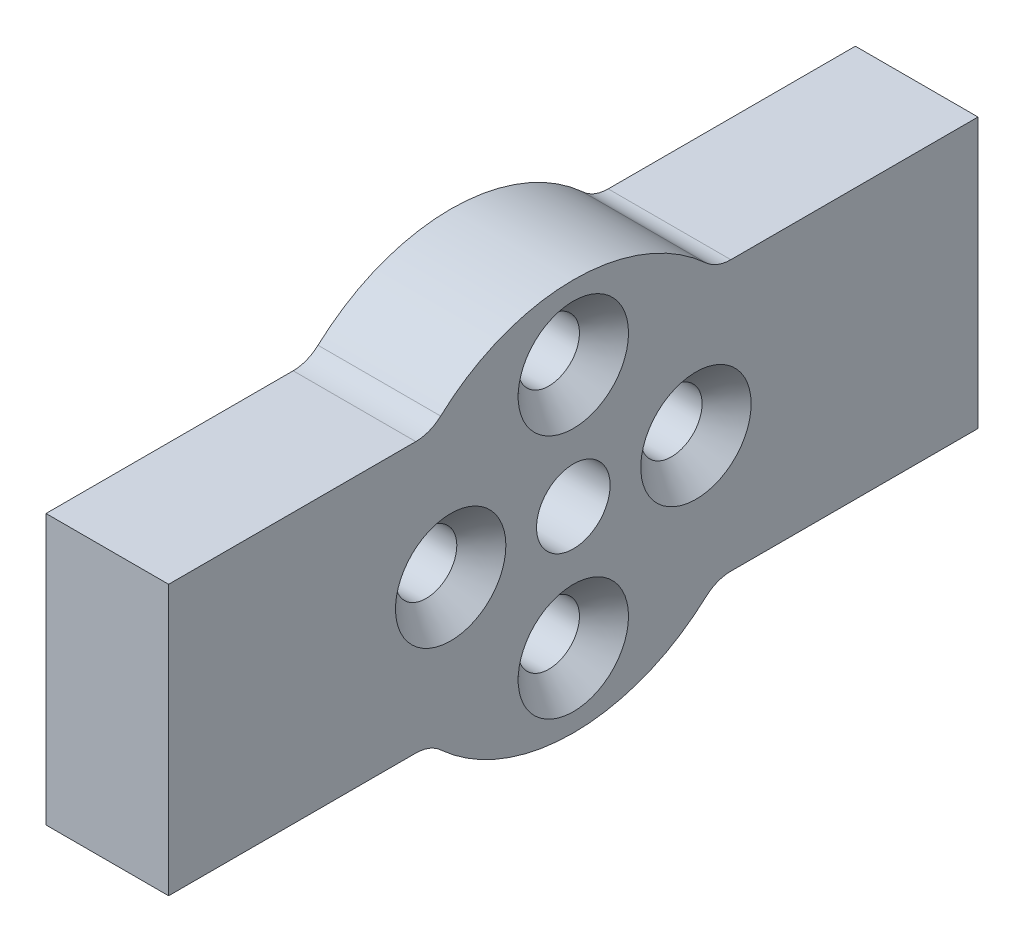
ISO-10303-21;
HEADER;
FILE_DESCRIPTION(('STEP AP214'),'2;1');
FILE_NAME('part.step','',(''),(''),'','','');
FILE_SCHEMA(('AUTOMOTIVE_DESIGN { 1 0 10303 214 1 1 1 1 }'));
ENDSEC;
DATA;
#1=APPLICATION_CONTEXT('core data for automotive mechanical design processes');
#2=APPLICATION_PROTOCOL_DEFINITION('international standard','automotive_design',2000,#1);
#3=PRODUCT_CONTEXT('',#1,'mechanical');
#4=PRODUCT('Part','Part','',(#3));
#5=PRODUCT_RELATED_PRODUCT_CATEGORY('part','',(#4));
#6=PRODUCT_DEFINITION_FORMATION('','',#4);
#7=PRODUCT_DEFINITION_CONTEXT('part definition',#1,'design');
#8=PRODUCT_DEFINITION('design','',#6,#7);
#9=PRODUCT_DEFINITION_SHAPE('','',#8);
#10=(LENGTH_UNIT() NAMED_UNIT(*) SI_UNIT(.MILLI.,.METRE.));
#11=(NAMED_UNIT(*) PLANE_ANGLE_UNIT() SI_UNIT($,.RADIAN.));
#12=(NAMED_UNIT(*) SI_UNIT($,.STERADIAN.) SOLID_ANGLE_UNIT());
#13=UNCERTAINTY_MEASURE_WITH_UNIT(LENGTH_MEASURE(1.E-05),#10,'distance_accuracy_value','');
#14=(GEOMETRIC_REPRESENTATION_CONTEXT(3) GLOBAL_UNCERTAINTY_ASSIGNED_CONTEXT((#13)) GLOBAL_UNIT_ASSIGNED_CONTEXT((#10,
#11,#12)) REPRESENTATION_CONTEXT('',''));
#15=CARTESIAN_POINT('',(0.,0.,0.));
#16=DIRECTION('',(0.,0.,1.));
#17=DIRECTION('',(1.,0.,0.));
#18=AXIS2_PLACEMENT_3D('',#15,#16,#17);
#19=CARTESIAN_POINT('',(0.,-1.39659314221713E-13,9.99999999999986));
#20=DIRECTION('',(1.,0.,0.));
#21=DIRECTION('',(0.,0.,-1.));
#22=AXIS2_PLACEMENT_3D('',#19,#20,#21);
#23=CYLINDRICAL_SURFACE('',#22,2.50000000000027);
#24=CARTESIAN_POINT('',(0.,-1.39659314221713E-13,9.99999999999986));
#25=DIRECTION('',(1.,0.,0.));
#26=DIRECTION('',(0.,0.,-1.));
#27=AXIS2_PLACEMENT_3D('',#24,#25,#26);
#28=CIRCLE('',#27,2.50000000000027);
#29=CARTESIAN_POINT('',(0.,-1.39659314221713E-13,7.49999999999959));
#30=VERTEX_POINT('',#29);
#31=EDGE_CURVE('E288',#30,#30,#28,.T.);
#32=ORIENTED_EDGE('',*,*,#31,.F.);
#33=EDGE_LOOP('',(#32));
#34=FACE_BOUND('',#33,.T.);
#35=CARTESIAN_POINT('',(8.,1.04744500833281E-13,10.));
#36=DIRECTION('',(1.,0.,0.));
#37=DIRECTION('',(0.,0.,-1.));
#38=AXIS2_PLACEMENT_3D('',#35,#36,#37);
#39=CIRCLE('',#38,2.5);
#40=CARTESIAN_POINT('',(8.,1.04744500833281E-13,7.5));
#41=VERTEX_POINT('',#40);
#42=EDGE_CURVE('E324',#41,#41,#39,.T.);
#43=ORIENTED_EDGE('',*,*,#42,.T.);
#44=EDGE_LOOP('',(#43));
#45=FACE_BOUND('',#44,.T.);
#46=ADVANCED_FACE('F31',(#34,#45),#23,.F.);
#47=CARTESIAN_POINT('',(0.,-10.,-2.8176792204172E-13));
#48=DIRECTION('',(1.,0.,0.));
#49=DIRECTION('',(0.,0.,-1.));
#50=AXIS2_PLACEMENT_3D('',#47,#48,#49);
#51=CYLINDRICAL_SURFACE('',#50,2.50000000000034);
#52=CARTESIAN_POINT('',(0.,-10.,-2.8176792204172E-13));
#53=DIRECTION('',(1.,0.,0.));
#54=DIRECTION('',(0.,0.,-1.));
#55=AXIS2_PLACEMENT_3D('',#52,#53,#54);
#56=CIRCLE('',#55,2.50000000000034);
#57=CARTESIAN_POINT('',(0.,-10.,-2.50000000000062));
#58=VERTEX_POINT('',#57);
#59=EDGE_CURVE('E292',#58,#58,#56,.T.);
#60=ORIENTED_EDGE('',*,*,#59,.F.);
#61=EDGE_LOOP('',(#60));
#62=FACE_BOUND('',#61,.T.);
#63=CARTESIAN_POINT('',(8.,-10.,-2.8176792204172E-13));
#64=DIRECTION('',(1.,0.,0.));
#65=DIRECTION('',(0.,0.,-1.));
#66=AXIS2_PLACEMENT_3D('',#63,#64,#65);
#67=CIRCLE('',#66,2.50000000000033);
#68=CARTESIAN_POINT('',(8.,-10.,-2.50000000000062));
#69=VERTEX_POINT('',#68);
#70=EDGE_CURVE('E318',#69,#69,#67,.T.);
#71=ORIENTED_EDGE('',*,*,#70,.T.);
#72=EDGE_LOOP('',(#71));
#73=FACE_BOUND('',#72,.T.);
#74=ADVANCED_FACE('F254',(#62,#73),#51,.F.);
#75=CARTESIAN_POINT('',(0.,0.,-10.));
#76=DIRECTION('',(1.,0.,0.));
#77=DIRECTION('',(0.,0.,-1.));
#78=AXIS2_PLACEMENT_3D('',#75,#76,#77);
#79=CYLINDRICAL_SURFACE('',#78,2.5);
#80=CARTESIAN_POINT('',(0.,0.,-10.));
#81=DIRECTION('',(1.,0.,0.));
#82=DIRECTION('',(0.,0.,-1.));
#83=AXIS2_PLACEMENT_3D('',#80,#81,#82);
#84=CIRCLE('',#83,2.5);
#85=CARTESIAN_POINT('',(0.,0.,-12.5));
#86=VERTEX_POINT('',#85);
#87=EDGE_CURVE('E296',#86,#86,#84,.T.);
#88=ORIENTED_EDGE('',*,*,#87,.F.);
#89=EDGE_LOOP('',(#88));
#90=FACE_BOUND('',#89,.T.);
#91=CARTESIAN_POINT('',(8.,0.,-10.));
#92=DIRECTION('',(1.,0.,0.));
#93=DIRECTION('',(0.,0.,-1.));
#94=AXIS2_PLACEMENT_3D('',#91,#92,#93);
#95=CIRCLE('',#94,2.5);
#96=CARTESIAN_POINT('',(8.,0.,-12.5));
#97=VERTEX_POINT('',#96);
#98=EDGE_CURVE('E312',#97,#97,#95,.T.);
#99=ORIENTED_EDGE('',*,*,#98,.T.);
#100=EDGE_LOOP('',(#99));
#101=FACE_BOUND('',#100,.T.);
#102=ADVANCED_FACE('F260',(#90,#101),#79,.F.);
#103=CARTESIAN_POINT('',(0.,10.,0.));
#104=DIRECTION('',(1.,0.,0.));
#105=DIRECTION('',(0.,0.,-1.));
#106=AXIS2_PLACEMENT_3D('',#103,#104,#105);
#107=CYLINDRICAL_SURFACE('',#106,2.5);
#108=CARTESIAN_POINT('',(0.,10.,0.));
#109=DIRECTION('',(1.,0.,0.));
#110=DIRECTION('',(0.,0.,-1.));
#111=AXIS2_PLACEMENT_3D('',#108,#109,#110);
#112=CIRCLE('',#111,2.5);
#113=CARTESIAN_POINT('',(0.,10.,-2.5));
#114=VERTEX_POINT('',#113);
#115=EDGE_CURVE('E156',#114,#114,#112,.T.);
#116=ORIENTED_EDGE('',*,*,#115,.F.);
#117=EDGE_LOOP('',(#116));
#118=FACE_BOUND('',#117,.T.);
#119=CARTESIAN_POINT('',(8.,10.,0.));
#120=DIRECTION('',(1.,0.,0.));
#121=DIRECTION('',(0.,0.,-1.));
#122=AXIS2_PLACEMENT_3D('',#119,#120,#121);
#123=CIRCLE('',#122,2.5);
#124=CARTESIAN_POINT('',(8.,10.,-2.5));
#125=VERTEX_POINT('',#124);
#126=EDGE_CURVE('E306',#125,#125,#123,.T.);
#127=ORIENTED_EDGE('',*,*,#126,.T.);
#128=EDGE_LOOP('',(#127));
#129=FACE_BOUND('',#128,.T.);
#130=ADVANCED_FACE('F271',(#118,#129),#107,.F.);
#131=CARTESIAN_POINT('',(10.,-11.,-12.8452325786651));
#132=DIRECTION('',(0.,1.,0.));
#133=DIRECTION('',(0.,0.,1.));
#134=AXIS2_PLACEMENT_3D('',#131,#132,#133);
#135=PLANE('',#134);
#136=DIRECTION('',(0.,0.,-1.));
#137=VECTOR('',#136,1.);
#138=CARTESIAN_POINT('',(0.,-11.,-12.8452325786651));
#139=LINE('',#138,#137);
#140=CARTESIAN_POINT('',(0.,-11.,-12.8452325786651));
#141=VERTEX_POINT('',#140);
#142=CARTESIAN_POINT('',(0.,-11.,-33.));
#143=VERTEX_POINT('',#142);
#144=EDGE_CURVE('E152',#141,#143,#139,.T.);
#145=ORIENTED_EDGE('',*,*,#144,.T.);
#146=DIRECTION('',(-1.,0.,0.));
#147=VECTOR('',#146,1.);
#148=CARTESIAN_POINT('',(10.,-11.,-33.));
#149=LINE('',#148,#147);
#150=CARTESIAN_POINT('',(10.,-11.,-33.));
#151=VERTEX_POINT('',#150);
#152=EDGE_CURVE('E11',#151,#143,#149,.T.);
#153=ORIENTED_EDGE('',*,*,#152,.F.);
#154=DIRECTION('',(0.,0.,-1.));
#155=VECTOR('',#154,1.);
#156=CARTESIAN_POINT('',(10.,-11.,-12.8452325786651));
#157=LINE('',#156,#155);
#158=CARTESIAN_POINT('',(10.,-11.,-12.8452325786651));
#159=VERTEX_POINT('',#158);
#160=EDGE_CURVE('E175',#159,#151,#157,.T.);
#161=ORIENTED_EDGE('',*,*,#160,.F.);
#162=DIRECTION('',(-1.,0.,0.));
#163=VECTOR('',#162,1.);
#164=CARTESIAN_POINT('',(10.,-11.,-12.8452325786651));
#165=LINE('',#164,#163);
#166=EDGE_CURVE('E148',#159,#141,#165,.T.);
#167=ORIENTED_EDGE('',*,*,#166,.T.);
#168=EDGE_LOOP('',(#145,#153,#161,#167));
#169=FACE_BOUND('',#168,.T.);
#170=ADVANCED_FACE('F33',(#169),#135,.F.);
#171=CARTESIAN_POINT('',(10.,11.,-33.));
#172=DIRECTION('',(0.,0.,1.));
#173=DIRECTION('',(1.,0.,0.));
#174=AXIS2_PLACEMENT_3D('',#171,#172,#173);
#175=PLANE('',#174);
#176=DIRECTION('',(0.,1.,0.));
#177=VECTOR('',#176,1.);
#178=CARTESIAN_POINT('',(0.,11.,-33.));
#179=LINE('',#178,#177);
#180=CARTESIAN_POINT('',(0.,11.,-33.));
#181=VERTEX_POINT('',#180);
#182=EDGE_CURVE('E155',#143,#181,#179,.T.);
#183=ORIENTED_EDGE('',*,*,#182,.T.);
#184=DIRECTION('',(-1.,0.,0.));
#185=VECTOR('',#184,1.);
#186=CARTESIAN_POINT('',(10.,11.,-33.));
#187=LINE('',#186,#185);
#188=CARTESIAN_POINT('',(10.,11.,-33.));
#189=VERTEX_POINT('',#188);
#190=EDGE_CURVE('E40',#189,#181,#187,.T.);
#191=ORIENTED_EDGE('',*,*,#190,.F.);
#192=DIRECTION('',(0.,1.,0.));
#193=VECTOR('',#192,1.);
#194=CARTESIAN_POINT('',(10.,11.,-33.));
#195=LINE('',#194,#193);
#196=EDGE_CURVE('E103',#151,#189,#195,.T.);
#197=ORIENTED_EDGE('',*,*,#196,.F.);
#198=ORIENTED_EDGE('',*,*,#152,.T.);
#199=EDGE_LOOP('',(#183,#191,#197,#198));
#200=FACE_BOUND('',#199,.T.);
#201=ADVANCED_FACE('F487',(#200),#175,.F.);
#202=CARTESIAN_POINT('',(10.,11.,-12.8452325786651));
#203=DIRECTION('',(0.,-1.,0.));
#204=DIRECTION('',(0.,0.,-1.));
#205=AXIS2_PLACEMENT_3D('',#202,#203,#204);
#206=PLANE('',#205);
#207=DIRECTION('',(0.,0.,1.));
#208=VECTOR('',#207,1.);
#209=CARTESIAN_POINT('',(0.,11.,-12.8452325786651));
#210=LINE('',#209,#208);
#211=CARTESIAN_POINT('',(0.,11.,-12.8452325786651));
#212=VERTEX_POINT('',#211);
#213=EDGE_CURVE('E158',#181,#212,#210,.T.);
#214=ORIENTED_EDGE('',*,*,#213,.T.);
#215=DIRECTION('',(-1.,0.,0.));
#216=VECTOR('',#215,1.);
#217=CARTESIAN_POINT('',(10.,11.,-12.8452325786651));
#218=LINE('',#217,#216);
#219=CARTESIAN_POINT('',(10.,11.,-12.8452325786651));
#220=VERTEX_POINT('',#219);
#221=EDGE_CURVE('E194',#220,#212,#218,.T.);
#222=ORIENTED_EDGE('',*,*,#221,.F.);
#223=DIRECTION('',(0.,0.,1.));
#224=VECTOR('',#223,1.);
#225=CARTESIAN_POINT('',(10.,11.,-12.8452325786651));
#226=LINE('',#225,#224);
#227=EDGE_CURVE('E202',#189,#220,#226,.T.);
#228=ORIENTED_EDGE('',*,*,#227,.F.);
#229=ORIENTED_EDGE('',*,*,#190,.T.);
#230=EDGE_LOOP('',(#214,#222,#228,#229));
#231=FACE_BOUND('',#230,.T.);
#232=ADVANCED_FACE('F200',(#231),#206,.F.);
#233=CARTESIAN_POINT('',(10.,14.,-12.8452325786651));
#234=DIRECTION('',(-1.,0.,0.));
#235=DIRECTION('',(0.,0.,1.));
#236=AXIS2_PLACEMENT_3D('',#233,#234,#235);
#237=CYLINDRICAL_SURFACE('',#236,3.);
#238=CARTESIAN_POINT('',(0.,14.,-12.8452325786651));
#239=DIRECTION('',(-1.,0.,0.));
#240=DIRECTION('',(0.,0.,1.));
#241=AXIS2_PLACEMENT_3D('',#238,#239,#240);
#242=CIRCLE('',#241,3.);
#243=CARTESIAN_POINT('',(0.,11.7894736842105,-10.8170379609812));
#244=VERTEX_POINT('',#243);
#245=EDGE_CURVE('E160',#212,#244,#242,.T.);
#246=ORIENTED_EDGE('',*,*,#245,.T.);
#247=DIRECTION('',(-1.,0.,0.));
#248=VECTOR('',#247,1.);
#249=CARTESIAN_POINT('',(10.,11.7894736842105,-10.8170379609812));
#250=LINE('',#249,#248);
#251=CARTESIAN_POINT('',(10.,11.7894736842105,-10.8170379609812));
#252=VERTEX_POINT('',#251);
#253=EDGE_CURVE('E191',#252,#244,#250,.T.);
#254=ORIENTED_EDGE('',*,*,#253,.F.);
#255=CARTESIAN_POINT('',(10.,14.,-12.8452325786651));
#256=DIRECTION('',(-1.,0.,0.));
#257=DIRECTION('',(0.,0.,1.));
#258=AXIS2_PLACEMENT_3D('',#255,#256,#257);
#259=CIRCLE('',#258,3.);
#260=EDGE_CURVE('E220',#220,#252,#259,.T.);
#261=ORIENTED_EDGE('',*,*,#260,.F.);
#262=ORIENTED_EDGE('',*,*,#221,.T.);
#263=EDGE_LOOP('',(#246,#254,#261,#262));
#264=FACE_BOUND('',#263,.T.);
#265=ADVANCED_FACE('F211',(#264),#237,.F.);
#266=CARTESIAN_POINT('',(10.,0.,0.));
#267=DIRECTION('',(-1.,0.,0.));
#268=DIRECTION('',(0.,0.,1.));
#269=AXIS2_PLACEMENT_3D('',#266,#267,#268);
#270=CYLINDRICAL_SURFACE('',#269,16.);
#271=CARTESIAN_POINT('',(0.,0.,0.));
#272=DIRECTION('',(1.,0.,0.));
#273=DIRECTION('',(0.,0.,-1.));
#274=AXIS2_PLACEMENT_3D('',#271,#272,#273);
#275=CIRCLE('',#274,16.);
#276=CARTESIAN_POINT('',(0.,11.7894736842105,10.8170379609812));
#277=VERTEX_POINT('',#276);
#278=EDGE_CURVE('E162',#244,#277,#275,.T.);
#279=ORIENTED_EDGE('',*,*,#278,.T.);
#280=DIRECTION('',(-1.,0.,0.));
#281=VECTOR('',#280,1.);
#282=CARTESIAN_POINT('',(10.,11.7894736842105,10.8170379609812));
#283=LINE('',#282,#281);
#284=CARTESIAN_POINT('',(10.,11.7894736842105,10.8170379609812));
#285=VERTEX_POINT('',#284);
#286=EDGE_CURVE('E188',#285,#277,#283,.T.);
#287=ORIENTED_EDGE('',*,*,#286,.F.);
#288=CARTESIAN_POINT('',(10.,0.,0.));
#289=DIRECTION('',(1.,0.,0.));
#290=DIRECTION('',(0.,0.,-1.));
#291=AXIS2_PLACEMENT_3D('',#288,#289,#290);
#292=CIRCLE('',#291,16.);
#293=EDGE_CURVE('E217',#252,#285,#292,.T.);
#294=ORIENTED_EDGE('',*,*,#293,.F.);
#295=ORIENTED_EDGE('',*,*,#253,.T.);
#296=EDGE_LOOP('',(#279,#287,#294,#295));
#297=FACE_BOUND('',#296,.T.);
#298=ADVANCED_FACE('F215',(#297),#270,.T.);
#299=CARTESIAN_POINT('',(10.,14.,12.8452325786651));
#300=DIRECTION('',(-1.,0.,0.));
#301=DIRECTION('',(0.,0.,1.));
#302=AXIS2_PLACEMENT_3D('',#299,#300,#301);
#303=CYLINDRICAL_SURFACE('',#302,3.);
#304=CARTESIAN_POINT('',(0.,14.,12.8452325786651));
#305=DIRECTION('',(-1.,0.,0.));
#306=DIRECTION('',(0.,0.,1.));
#307=AXIS2_PLACEMENT_3D('',#304,#305,#306);
#308=CIRCLE('',#307,3.);
#309=CARTESIAN_POINT('',(0.,11.,12.8452325786651));
#310=VERTEX_POINT('',#309);
#311=EDGE_CURVE('E164',#277,#310,#308,.T.);
#312=ORIENTED_EDGE('',*,*,#311,.T.);
#313=DIRECTION('',(-1.,0.,0.));
#314=VECTOR('',#313,1.);
#315=CARTESIAN_POINT('',(10.,11.,12.8452325786651));
#316=LINE('',#315,#314);
#317=CARTESIAN_POINT('',(10.,11.,12.8452325786651));
#318=VERTEX_POINT('',#317);
#319=EDGE_CURVE('E185',#318,#310,#316,.T.);
#320=ORIENTED_EDGE('',*,*,#319,.F.);
#321=CARTESIAN_POINT('',(10.,14.,12.8452325786651));
#322=DIRECTION('',(-1.,0.,0.));
#323=DIRECTION('',(0.,0.,1.));
#324=AXIS2_PLACEMENT_3D('',#321,#322,#323);
#325=CIRCLE('',#324,3.);
#326=EDGE_CURVE('E219',#285,#318,#325,.T.);
#327=ORIENTED_EDGE('',*,*,#326,.F.);
#328=ORIENTED_EDGE('',*,*,#286,.T.);
#329=EDGE_LOOP('',(#312,#320,#327,#328));
#330=FACE_BOUND('',#329,.T.);
#331=ADVANCED_FACE('F452',(#330),#303,.F.);
#332=CARTESIAN_POINT('',(10.,11.,33.));
#333=DIRECTION('',(0.,-1.,0.));
#334=DIRECTION('',(0.,0.,-1.));
#335=AXIS2_PLACEMENT_3D('',#332,#333,#334);
#336=PLANE('',#335);
#337=DIRECTION('',(0.,0.,1.));
#338=VECTOR('',#337,1.);
#339=CARTESIAN_POINT('',(0.,11.,33.));
#340=LINE('',#339,#338);
#341=CARTESIAN_POINT('',(0.,11.,33.));
#342=VERTEX_POINT('',#341);
#343=EDGE_CURVE('E166',#310,#342,#340,.T.);
#344=ORIENTED_EDGE('',*,*,#343,.T.);
#345=DIRECTION('',(-1.,0.,0.));
#346=VECTOR('',#345,1.);
#347=CARTESIAN_POINT('',(10.,11.,33.));
#348=LINE('',#347,#346);
#349=CARTESIAN_POINT('',(10.,11.,33.));
#350=VERTEX_POINT('',#349);
#351=EDGE_CURVE('E182',#350,#342,#348,.T.);
#352=ORIENTED_EDGE('',*,*,#351,.F.);
#353=DIRECTION('',(0.,0.,1.));
#354=VECTOR('',#353,1.);
#355=CARTESIAN_POINT('',(10.,11.,33.));
#356=LINE('',#355,#354);
#357=EDGE_CURVE('E222',#318,#350,#356,.T.);
#358=ORIENTED_EDGE('',*,*,#357,.F.);
#359=ORIENTED_EDGE('',*,*,#319,.T.);
#360=EDGE_LOOP('',(#344,#352,#358,#359));
#361=FACE_BOUND('',#360,.T.);
#362=ADVANCED_FACE('F443',(#361),#336,.F.);
#363=CARTESIAN_POINT('',(10.,11.,33.));
#364=DIRECTION('',(0.,0.,-1.));
#365=DIRECTION('',(-1.,0.,0.));
#366=AXIS2_PLACEMENT_3D('',#363,#364,#365);
#367=PLANE('',#366);
#368=DIRECTION('',(0.,-1.,0.));
#369=VECTOR('',#368,1.);
#370=CARTESIAN_POINT('',(0.,11.,33.));
#371=LINE('',#370,#369);
#372=CARTESIAN_POINT('',(0.,-11.,33.));
#373=VERTEX_POINT('',#372);
#374=EDGE_CURVE('E168',#342,#373,#371,.T.);
#375=ORIENTED_EDGE('',*,*,#374,.T.);
#376=DIRECTION('',(-1.,0.,0.));
#377=VECTOR('',#376,1.);
#378=CARTESIAN_POINT('',(10.,-11.,33.));
#379=LINE('',#378,#377);
#380=CARTESIAN_POINT('',(10.,-11.,33.));
#381=VERTEX_POINT('',#380);
#382=EDGE_CURVE('E179',#381,#373,#379,.T.);
#383=ORIENTED_EDGE('',*,*,#382,.F.);
#384=DIRECTION('',(0.,-1.,0.));
#385=VECTOR('',#384,1.);
#386=CARTESIAN_POINT('',(10.,11.,33.));
#387=LINE('',#386,#385);
#388=EDGE_CURVE('E228',#350,#381,#387,.T.);
#389=ORIENTED_EDGE('',*,*,#388,.F.);
#390=ORIENTED_EDGE('',*,*,#351,.T.);
#391=EDGE_LOOP('',(#375,#383,#389,#390));
#392=FACE_BOUND('',#391,.T.);
#393=ADVANCED_FACE('F234',(#392),#367,.F.);
#394=CARTESIAN_POINT('',(10.,-11.,33.));
#395=DIRECTION('',(0.,1.,0.));
#396=DIRECTION('',(0.,0.,1.));
#397=AXIS2_PLACEMENT_3D('',#394,#395,#396);
#398=PLANE('',#397);
#399=DIRECTION('',(0.,0.,-1.));
#400=VECTOR('',#399,1.);
#401=CARTESIAN_POINT('',(0.,-11.,33.));
#402=LINE('',#401,#400);
#403=CARTESIAN_POINT('',(0.,-11.,12.8452325786651));
#404=VERTEX_POINT('',#403);
#405=EDGE_CURVE('E170',#373,#404,#402,.T.);
#406=ORIENTED_EDGE('',*,*,#405,.T.);
#407=DIRECTION('',(-1.,0.,0.));
#408=VECTOR('',#407,1.);
#409=CARTESIAN_POINT('',(10.,-11.,12.8452325786651));
#410=LINE('',#409,#408);
#411=CARTESIAN_POINT('',(10.,-11.,12.8452325786651));
#412=VERTEX_POINT('',#411);
#413=EDGE_CURVE('E143',#412,#404,#410,.T.);
#414=ORIENTED_EDGE('',*,*,#413,.F.);
#415=DIRECTION('',(0.,0.,-1.));
#416=VECTOR('',#415,1.);
#417=CARTESIAN_POINT('',(10.,-11.,33.));
#418=LINE('',#417,#416);
#419=EDGE_CURVE('E134',#381,#412,#418,.T.);
#420=ORIENTED_EDGE('',*,*,#419,.F.);
#421=ORIENTED_EDGE('',*,*,#382,.T.);
#422=EDGE_LOOP('',(#406,#414,#420,#421));
#423=FACE_BOUND('',#422,.T.);
#424=ADVANCED_FACE('F238',(#423),#398,.F.);
#425=CARTESIAN_POINT('',(10.,-14.,12.8452325786651));
#426=DIRECTION('',(-1.,0.,0.));
#427=DIRECTION('',(0.,0.,1.));
#428=AXIS2_PLACEMENT_3D('',#425,#426,#427);
#429=CYLINDRICAL_SURFACE('',#428,3.);
#430=CARTESIAN_POINT('',(0.,-14.,12.8452325786651));
#431=DIRECTION('',(-1.,0.,0.));
#432=DIRECTION('',(0.,0.,1.));
#433=AXIS2_PLACEMENT_3D('',#430,#431,#432);
#434=CIRCLE('',#433,3.);
#435=CARTESIAN_POINT('',(0.,-11.7894736842105,10.8170379609812));
#436=VERTEX_POINT('',#435);
#437=EDGE_CURVE('E142',#404,#436,#434,.T.);
#438=ORIENTED_EDGE('',*,*,#437,.T.);
#439=DIRECTION('',(-1.,0.,0.));
#440=VECTOR('',#439,1.);
#441=CARTESIAN_POINT('',(10.,-11.7894736842105,10.8170379609812));
#442=LINE('',#441,#440);
#443=CARTESIAN_POINT('',(10.,-11.7894736842105,10.8170379609812));
#444=VERTEX_POINT('',#443);
#445=EDGE_CURVE('E139',#444,#436,#442,.T.);
#446=ORIENTED_EDGE('',*,*,#445,.F.);
#447=CARTESIAN_POINT('',(10.,-14.,12.8452325786651));
#448=DIRECTION('',(-1.,0.,0.));
#449=DIRECTION('',(0.,0.,1.));
#450=AXIS2_PLACEMENT_3D('',#447,#448,#449);
#451=CIRCLE('',#450,3.);
#452=EDGE_CURVE('E128',#412,#444,#451,.T.);
#453=ORIENTED_EDGE('',*,*,#452,.F.);
#454=ORIENTED_EDGE('',*,*,#413,.T.);
#455=EDGE_LOOP('',(#438,#446,#453,#454));
#456=FACE_BOUND('',#455,.T.);
#457=ADVANCED_FACE('F140',(#456),#429,.F.);
#458=CARTESIAN_POINT('',(10.,0.,0.));
#459=DIRECTION('',(-1.,0.,0.));
#460=DIRECTION('',(0.,0.,1.));
#461=AXIS2_PLACEMENT_3D('',#458,#459,#460);
#462=CYLINDRICAL_SURFACE('',#461,16.);
#463=CARTESIAN_POINT('',(0.,0.,0.));
#464=DIRECTION('',(1.,0.,0.));
#465=DIRECTION('',(0.,0.,-1.));
#466=AXIS2_PLACEMENT_3D('',#463,#464,#465);
#467=CIRCLE('',#466,16.);
#468=CARTESIAN_POINT('',(0.,-11.7894736842105,-10.8170379609812));
#469=VERTEX_POINT('',#468);
#470=EDGE_CURVE('E89',#436,#469,#467,.T.);
#471=ORIENTED_EDGE('',*,*,#470,.T.);
#472=DIRECTION('',(-1.,0.,0.));
#473=VECTOR('',#472,1.);
#474=CARTESIAN_POINT('',(10.,-11.7894736842105,-10.8170379609812));
#475=LINE('',#474,#473);
#476=CARTESIAN_POINT('',(10.,-11.7894736842105,-10.8170379609812));
#477=VERTEX_POINT('',#476);
#478=EDGE_CURVE('E144',#477,#469,#475,.T.);
#479=ORIENTED_EDGE('',*,*,#478,.F.);
#480=CARTESIAN_POINT('',(10.,0.,0.));
#481=DIRECTION('',(1.,0.,0.));
#482=DIRECTION('',(0.,0.,-1.));
#483=AXIS2_PLACEMENT_3D('',#480,#481,#482);
#484=CIRCLE('',#483,16.);
#485=EDGE_CURVE('E132',#444,#477,#484,.T.);
#486=ORIENTED_EDGE('',*,*,#485,.F.);
#487=ORIENTED_EDGE('',*,*,#445,.T.);
#488=EDGE_LOOP('',(#471,#479,#486,#487));
#489=FACE_BOUND('',#488,.T.);
#490=ADVANCED_FACE('F146',(#489),#462,.T.);
#491=CARTESIAN_POINT('',(10.,-14.,-12.8452325786651));
#492=DIRECTION('',(-1.,0.,0.));
#493=DIRECTION('',(0.,0.,1.));
#494=AXIS2_PLACEMENT_3D('',#491,#492,#493);
#495=CYLINDRICAL_SURFACE('',#494,3.);
#496=CARTESIAN_POINT('',(0.,-14.,-12.8452325786651));
#497=DIRECTION('',(-1.,0.,0.));
#498=DIRECTION('',(0.,0.,-1.));
#499=AXIS2_PLACEMENT_3D('',#496,#497,#498);
#500=CIRCLE('',#499,3.);
#501=EDGE_CURVE('E95',#469,#141,#500,.T.);
#502=ORIENTED_EDGE('',*,*,#501,.T.);
#503=ORIENTED_EDGE('',*,*,#166,.F.);
#504=CARTESIAN_POINT('',(10.,-14.,-12.8452325786651));
#505=DIRECTION('',(-1.,0.,0.));
#506=DIRECTION('',(0.,0.,-1.));
#507=AXIS2_PLACEMENT_3D('',#504,#505,#506);
#508=CIRCLE('',#507,3.);
#509=EDGE_CURVE('E48',#477,#159,#508,.T.);
#510=ORIENTED_EDGE('',*,*,#509,.F.);
#511=ORIENTED_EDGE('',*,*,#478,.T.);
#512=EDGE_LOOP('',(#502,#503,#510,#511));
#513=FACE_BOUND('',#512,.T.);
#514=ADVANCED_FACE('F242',(#513),#495,.F.);
#515=CARTESIAN_POINT('',(10.,14.,-12.8452325786651));
#516=DIRECTION('',(-1.,0.,0.));
#517=DIRECTION('',(0.,0.,1.));
#518=AXIS2_PLACEMENT_3D('',#515,#516,#517);
#519=PLANE('',#518);
#520=CARTESIAN_POINT('',(10.,0.,0.));
#521=DIRECTION('',(1.,0.,0.));
#522=DIRECTION('',(0.,0.,-1.));
#523=AXIS2_PLACEMENT_3D('',#520,#521,#522);
#524=CIRCLE('',#523,3.);
#525=CARTESIAN_POINT('',(10.,0.,-3.));
#526=VERTEX_POINT('',#525);
#527=EDGE_CURVE('E330',#526,#526,#524,.T.);
#528=ORIENTED_EDGE('',*,*,#527,.F.);
#529=EDGE_LOOP('',(#528));
#530=FACE_BOUND('',#529,.T.);
#531=CARTESIAN_POINT('',(10.,1.04744500833281E-13,10.));
#532=DIRECTION('',(1.,0.,0.));
#533=DIRECTION('',(0.,0.,-1.));
#534=AXIS2_PLACEMENT_3D('',#531,#532,#533);
#535=CIRCLE('',#534,4.5);
#536=CARTESIAN_POINT('',(10.,1.04744500833281E-13,5.5));
#537=VERTEX_POINT('',#536);
#538=EDGE_CURVE('E327',#537,#537,#535,.T.);
#539=ORIENTED_EDGE('',*,*,#538,.F.);
#540=EDGE_LOOP('',(#539));
#541=FACE_BOUND('',#540,.T.);
#542=CARTESIAN_POINT('',(10.,-10.,-2.8176792204172E-13));
#543=DIRECTION('',(1.,0.,0.));
#544=DIRECTION('',(0.,0.,-1.));
#545=AXIS2_PLACEMENT_3D('',#542,#543,#544);
#546=CIRCLE('',#545,4.50000000000034);
#547=CARTESIAN_POINT('',(10.,-10.,-4.50000000000062));
#548=VERTEX_POINT('',#547);
#549=EDGE_CURVE('E321',#548,#548,#546,.T.);
#550=ORIENTED_EDGE('',*,*,#549,.F.);
#551=EDGE_LOOP('',(#550));
#552=FACE_BOUND('',#551,.T.);
#553=CARTESIAN_POINT('',(10.,0.,-10.));
#554=DIRECTION('',(1.,0.,0.));
#555=DIRECTION('',(0.,0.,-1.));
#556=AXIS2_PLACEMENT_3D('',#553,#554,#555);
#557=CIRCLE('',#556,4.5);
#558=CARTESIAN_POINT('',(10.,0.,-14.5));
#559=VERTEX_POINT('',#558);
#560=EDGE_CURVE('E315',#559,#559,#557,.T.);
#561=ORIENTED_EDGE('',*,*,#560,.F.);
#562=EDGE_LOOP('',(#561));
#563=FACE_BOUND('',#562,.T.);
#564=CARTESIAN_POINT('',(10.,10.,0.));
#565=DIRECTION('',(1.,0.,0.));
#566=DIRECTION('',(0.,0.,-1.));
#567=AXIS2_PLACEMENT_3D('',#564,#565,#566);
#568=CIRCLE('',#567,4.5);
#569=CARTESIAN_POINT('',(10.,10.,-4.5));
#570=VERTEX_POINT('',#569);
#571=EDGE_CURVE('E309',#570,#570,#568,.T.);
#572=ORIENTED_EDGE('',*,*,#571,.F.);
#573=EDGE_LOOP('',(#572));
#574=FACE_BOUND('',#573,.T.);
#575=ORIENTED_EDGE('',*,*,#160,.T.);
#576=ORIENTED_EDGE('',*,*,#196,.T.);
#577=ORIENTED_EDGE('',*,*,#227,.T.);
#578=ORIENTED_EDGE('',*,*,#260,.T.);
#579=ORIENTED_EDGE('',*,*,#293,.T.);
#580=ORIENTED_EDGE('',*,*,#326,.T.);
#581=ORIENTED_EDGE('',*,*,#357,.T.);
#582=ORIENTED_EDGE('',*,*,#388,.T.);
#583=ORIENTED_EDGE('',*,*,#419,.T.);
#584=ORIENTED_EDGE('',*,*,#452,.T.);
#585=ORIENTED_EDGE('',*,*,#485,.T.);
#586=ORIENTED_EDGE('',*,*,#509,.T.);
#587=EDGE_LOOP('',(#575,#576,#577,#578,#579,#580,#581,#582,#583,#584,#585,#586));
#588=FACE_BOUND('',#587,.T.);
#589=ADVANCED_FACE('F130',(#530,#541,#552,#563,#574,#588),#519,.F.);
#590=CARTESIAN_POINT('',(0.,14.,-12.8452325786651));
#591=DIRECTION('',(-1.,0.,0.));
#592=DIRECTION('',(0.,0.,1.));
#593=AXIS2_PLACEMENT_3D('',#590,#591,#592);
#594=PLANE('',#593);
#595=CARTESIAN_POINT('',(0.,0.,0.));
#596=DIRECTION('',(1.,0.,0.));
#597=DIRECTION('',(0.,0.,-1.));
#598=AXIS2_PLACEMENT_3D('',#595,#596,#597);
#599=CIRCLE('',#598,3.);
#600=CARTESIAN_POINT('',(0.,0.,-3.));
#601=VERTEX_POINT('',#600);
#602=EDGE_CURVE('E285',#601,#601,#599,.T.);
#603=ORIENTED_EDGE('',*,*,#602,.T.);
#604=EDGE_LOOP('',(#603));
#605=FACE_BOUND('',#604,.T.);
#606=ORIENTED_EDGE('',*,*,#31,.T.);
#607=EDGE_LOOP('',(#606));
#608=FACE_BOUND('',#607,.T.);
#609=ORIENTED_EDGE('',*,*,#59,.T.);
#610=EDGE_LOOP('',(#609));
#611=FACE_BOUND('',#610,.T.);
#612=ORIENTED_EDGE('',*,*,#87,.T.);
#613=EDGE_LOOP('',(#612));
#614=FACE_BOUND('',#613,.T.);
#615=ORIENTED_EDGE('',*,*,#115,.T.);
#616=EDGE_LOOP('',(#615));
#617=FACE_BOUND('',#616,.T.);
#618=ORIENTED_EDGE('',*,*,#144,.F.);
#619=ORIENTED_EDGE('',*,*,#501,.F.);
#620=ORIENTED_EDGE('',*,*,#470,.F.);
#621=ORIENTED_EDGE('',*,*,#437,.F.);
#622=ORIENTED_EDGE('',*,*,#405,.F.);
#623=ORIENTED_EDGE('',*,*,#374,.F.);
#624=ORIENTED_EDGE('',*,*,#343,.F.);
#625=ORIENTED_EDGE('',*,*,#311,.F.);
#626=ORIENTED_EDGE('',*,*,#278,.F.);
#627=ORIENTED_EDGE('',*,*,#245,.F.);
#628=ORIENTED_EDGE('',*,*,#213,.F.);
#629=ORIENTED_EDGE('',*,*,#182,.F.);
#630=EDGE_LOOP('',(#618,#619,#620,#621,#622,#623,#624,#625,#626,#627,#628,#629));
#631=FACE_BOUND('',#630,.T.);
#632=ADVANCED_FACE('F206',(#605,#608,#611,#614,#617,#631),#594,.T.);
#633=CARTESIAN_POINT('',(10.,10.,0.));
#634=DIRECTION('',(1.,0.,0.));
#635=DIRECTION('',(0.,0.,-1.));
#636=AXIS2_PLACEMENT_3D('',#633,#634,#635);
#637=CONICAL_SURFACE('',#636,4.5,0.785398163397449);
#638=ORIENTED_EDGE('',*,*,#126,.F.);
#639=EDGE_LOOP('',(#638));
#640=FACE_BOUND('',#639,.T.);
#641=ORIENTED_EDGE('',*,*,#571,.T.);
#642=EDGE_LOOP('',(#641));
#643=FACE_BOUND('',#642,.T.);
#644=ADVANCED_FACE('F266',(#640,#643),#637,.F.);
#645=CARTESIAN_POINT('',(10.,0.,-10.));
#646=DIRECTION('',(1.,0.,0.));
#647=DIRECTION('',(0.,0.,-1.));
#648=AXIS2_PLACEMENT_3D('',#645,#646,#647);
#649=CONICAL_SURFACE('',#648,4.5,0.785398163397449);
#650=ORIENTED_EDGE('',*,*,#98,.F.);
#651=EDGE_LOOP('',(#650));
#652=FACE_BOUND('',#651,.T.);
#653=ORIENTED_EDGE('',*,*,#560,.T.);
#654=EDGE_LOOP('',(#653));
#655=FACE_BOUND('',#654,.T.);
#656=ADVANCED_FACE('F280',(#652,#655),#649,.F.);
#657=CARTESIAN_POINT('',(10.,-10.,-2.8176792204172E-13));
#658=DIRECTION('',(1.,0.,0.));
#659=DIRECTION('',(0.,0.,-1.));
#660=AXIS2_PLACEMENT_3D('',#657,#658,#659);
#661=CONICAL_SURFACE('',#660,4.50000000000034,0.785398163397449);
#662=ORIENTED_EDGE('',*,*,#70,.F.);
#663=EDGE_LOOP('',(#662));
#664=FACE_BOUND('',#663,.T.);
#665=ORIENTED_EDGE('',*,*,#549,.T.);
#666=EDGE_LOOP('',(#665));
#667=FACE_BOUND('',#666,.T.);
#668=ADVANCED_FACE('F347',(#664,#667),#661,.F.);
#669=CARTESIAN_POINT('',(10.,1.04744500833281E-13,10.));
#670=DIRECTION('',(1.,0.,0.));
#671=DIRECTION('',(0.,0.,-1.));
#672=AXIS2_PLACEMENT_3D('',#669,#670,#671);
#673=CONICAL_SURFACE('',#672,4.5,0.785398163397449);
#674=ORIENTED_EDGE('',*,*,#42,.F.);
#675=EDGE_LOOP('',(#674));
#676=FACE_BOUND('',#675,.T.);
#677=ORIENTED_EDGE('',*,*,#538,.T.);
#678=EDGE_LOOP('',(#677));
#679=FACE_BOUND('',#678,.T.);
#680=ADVANCED_FACE('F352',(#676,#679),#673,.F.);
#681=CARTESIAN_POINT('',(0.,0.,0.));
#682=DIRECTION('',(1.,0.,0.));
#683=DIRECTION('',(0.,0.,-1.));
#684=AXIS2_PLACEMENT_3D('',#681,#682,#683);
#685=CYLINDRICAL_SURFACE('',#684,3.);
#686=ORIENTED_EDGE('',*,*,#602,.F.);
#687=EDGE_LOOP('',(#686));
#688=FACE_BOUND('',#687,.T.);
#689=ORIENTED_EDGE('',*,*,#527,.T.);
#690=EDGE_LOOP('',(#689));
#691=FACE_BOUND('',#690,.T.);
#692=ADVANCED_FACE('F335',(#688,#691),#685,.F.);
#693=CLOSED_SHELL('',(#46,#74,#102,#130,#170,#201,#232,#265,#298,#331,#362,#393,#424,#457,#490,
#514,#589,#632,#644,#656,#668,#680,#692));
#694=MANIFOLD_SOLID_BREP('B2',#693);
#695=ADVANCED_BREP_SHAPE_REPRESENTATION('',(#18,#694),#14);
#696=SHAPE_DEFINITION_REPRESENTATION(#9,#695);
ENDSEC;
END-ISO-10303-21;
